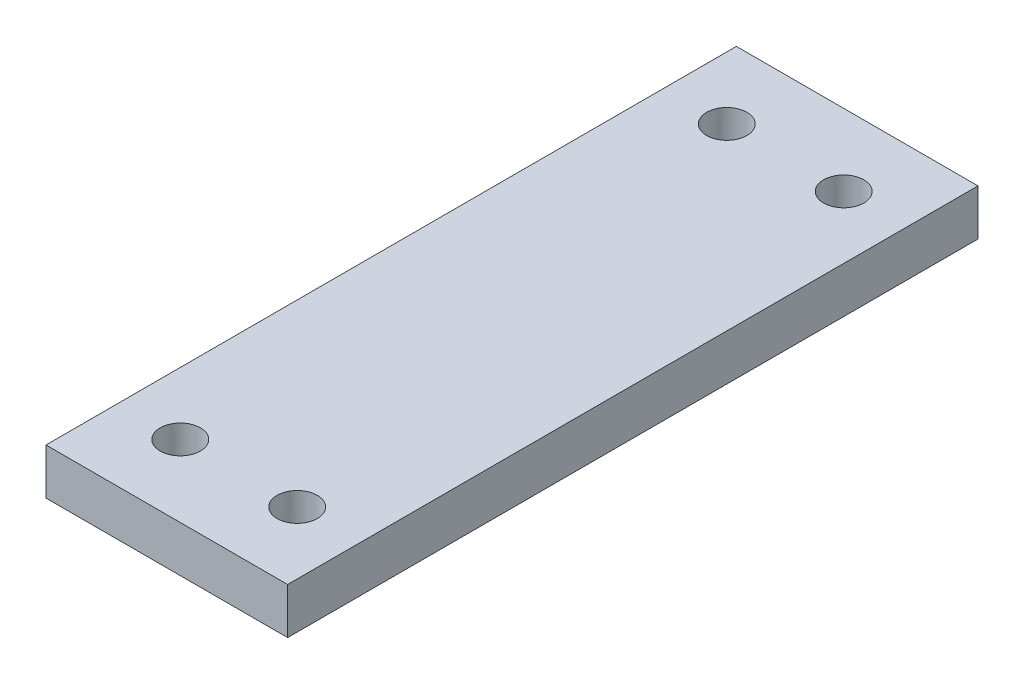
ISO-10303-21;
HEADER;
FILE_DESCRIPTION(('STEP AP214'),'2;1');
FILE_NAME('part.step','',(''),(''),'','','');
FILE_SCHEMA(('AUTOMOTIVE_DESIGN { 1 0 10303 214 1 1 1 1 }'));
ENDSEC;
DATA;
#1=APPLICATION_CONTEXT('core data for automotive mechanical design processes');
#2=APPLICATION_PROTOCOL_DEFINITION('international standard','automotive_design',2000,#1);
#3=PRODUCT_CONTEXT('',#1,'mechanical');
#4=PRODUCT('Part','Part','',(#3));
#5=PRODUCT_RELATED_PRODUCT_CATEGORY('part','',(#4));
#6=PRODUCT_DEFINITION_FORMATION('','',#4);
#7=PRODUCT_DEFINITION_CONTEXT('part definition',#1,'design');
#8=PRODUCT_DEFINITION('design','',#6,#7);
#9=PRODUCT_DEFINITION_SHAPE('','',#8);
#10=(LENGTH_UNIT() NAMED_UNIT(*) SI_UNIT(.MILLI.,.METRE.));
#11=(NAMED_UNIT(*) PLANE_ANGLE_UNIT() SI_UNIT($,.RADIAN.));
#12=(NAMED_UNIT(*) SI_UNIT($,.STERADIAN.) SOLID_ANGLE_UNIT());
#13=UNCERTAINTY_MEASURE_WITH_UNIT(LENGTH_MEASURE(1.E-05),#10,'distance_accuracy_value','');
#14=(GEOMETRIC_REPRESENTATION_CONTEXT(3) GLOBAL_UNCERTAINTY_ASSIGNED_CONTEXT((#13)) GLOBAL_UNIT_ASSIGNED_CONTEXT((#10,
#11,#12)) REPRESENTATION_CONTEXT('',''));
#15=CARTESIAN_POINT('',(0.,0.,0.));
#16=DIRECTION('',(0.,0.,1.));
#17=DIRECTION('',(1.,0.,0.));
#18=AXIS2_PLACEMENT_3D('',#15,#16,#17);
#19=CARTESIAN_POINT('',(-273.74896618523,-35.5197470884147,30.6347977229986));
#20=DIRECTION('',(-1.,0.,0.));
#21=DIRECTION('',(0.,0.,1.));
#22=AXIS2_PLACEMENT_3D('',#19,#20,#21);
#23=PLANE('',#22);
#24=DIRECTION('',(0.,0.,-1.));
#25=VECTOR('',#24,1.);
#26=CARTESIAN_POINT('',(-273.74896618523,-31.5197470884147,-12.3652022770014));
#27=LINE('',#26,#25);
#28=CARTESIAN_POINT('',(-273.74896618523,-31.5197470884147,39.1347977229986));
#29=VERTEX_POINT('',#28);
#30=CARTESIAN_POINT('',(-273.74896618523,-31.5197470884147,-20.8652022770014));
#31=VERTEX_POINT('',#30);
#32=EDGE_CURVE('E71',#29,#31,#27,.T.);
#33=ORIENTED_EDGE('',*,*,#32,.T.);
#34=DIRECTION('',(0.,-1.,0.));
#35=VECTOR('',#34,1.);
#36=CARTESIAN_POINT('',(-273.74896618523,-31.5197470884147,-20.8652022770014));
#37=LINE('',#36,#35);
#38=CARTESIAN_POINT('',(-273.74896618523,-35.5197470884147,-20.8652022770014));
#39=VERTEX_POINT('',#38);
#40=EDGE_CURVE('E83',#31,#39,#37,.T.);
#41=ORIENTED_EDGE('',*,*,#40,.T.);
#42=DIRECTION('',(0.,0.,1.));
#43=VECTOR('',#42,1.);
#44=CARTESIAN_POINT('',(-273.74896618523,-35.5197470884147,30.6347977229986));
#45=LINE('',#44,#43);
#46=CARTESIAN_POINT('',(-273.74896618523,-35.5197470884147,39.1347977229986));
#47=VERTEX_POINT('',#46);
#48=EDGE_CURVE('E65',#39,#47,#45,.T.);
#49=ORIENTED_EDGE('',*,*,#48,.T.);
#50=DIRECTION('',(0.,-1.,0.));
#51=VECTOR('',#50,1.);
#52=CARTESIAN_POINT('',(-273.74896618523,-31.5197470884147,39.1347977229986));
#53=LINE('',#52,#51);
#54=EDGE_CURVE('E80',#29,#47,#53,.T.);
#55=ORIENTED_EDGE('',*,*,#54,.F.);
#56=EDGE_LOOP('',(#33,#41,#49,#55));
#57=FACE_BOUND('',#56,.T.);
#58=ADVANCED_FACE('F37',(#57),#23,.T.);
#59=CARTESIAN_POINT('',(-252.74896618523,-35.5197470884147,30.6347977229986));
#60=DIRECTION('',(1.,0.,0.));
#61=DIRECTION('',(0.,0.,-1.));
#62=AXIS2_PLACEMENT_3D('',#59,#60,#61);
#63=PLANE('',#62);
#64=DIRECTION('',(0.,0.,1.));
#65=VECTOR('',#64,1.);
#66=CARTESIAN_POINT('',(-252.74896618523,-31.5197470884147,-12.3652022770014));
#67=LINE('',#66,#65);
#68=CARTESIAN_POINT('',(-252.74896618523,-31.5197470884147,-20.8652022770014));
#69=VERTEX_POINT('',#68);
#70=CARTESIAN_POINT('',(-252.74896618523,-31.5197470884147,39.1347977229986));
#71=VERTEX_POINT('',#70);
#72=EDGE_CURVE('E53',#69,#71,#67,.T.);
#73=ORIENTED_EDGE('',*,*,#72,.T.);
#74=DIRECTION('',(0.,-1.,0.));
#75=VECTOR('',#74,1.);
#76=CARTESIAN_POINT('',(-252.74896618523,-31.5197470884147,39.1347977229986));
#77=LINE('',#76,#75);
#78=CARTESIAN_POINT('',(-252.74896618523,-35.5197470884147,39.1347977229986));
#79=VERTEX_POINT('',#78);
#80=EDGE_CURVE('E94',#71,#79,#77,.T.);
#81=ORIENTED_EDGE('',*,*,#80,.T.);
#82=DIRECTION('',(0.,0.,-1.));
#83=VECTOR('',#82,1.);
#84=CARTESIAN_POINT('',(-252.74896618523,-35.5197470884147,30.6347977229986));
#85=LINE('',#84,#83);
#86=CARTESIAN_POINT('',(-252.74896618523,-35.5197470884147,-20.8652022770014));
#87=VERTEX_POINT('',#86);
#88=EDGE_CURVE('E45',#79,#87,#85,.T.);
#89=ORIENTED_EDGE('',*,*,#88,.T.);
#90=DIRECTION('',(0.,-1.,0.));
#91=VECTOR('',#90,1.);
#92=CARTESIAN_POINT('',(-252.74896618523,-31.5197470884147,-20.8652022770014));
#93=LINE('',#92,#91);
#94=EDGE_CURVE('E107',#69,#87,#93,.T.);
#95=ORIENTED_EDGE('',*,*,#94,.F.);
#96=EDGE_LOOP('',(#73,#81,#89,#95));
#97=FACE_BOUND('',#96,.T.);
#98=ADVANCED_FACE('F166',(#97),#63,.T.);
#99=CARTESIAN_POINT('',(-229.14595887983,-35.5197470884147,0.));
#100=DIRECTION('',(0.,1.,0.));
#101=DIRECTION('',(0.,0.,1.));
#102=AXIS2_PLACEMENT_3D('',#99,#100,#101);
#103=PLANE('',#102);
#104=CARTESIAN_POINT('',(-263.248966185229,-35.5197470884147,19.4217977229986));
#105=DIRECTION('',(0.,1.,0.));
#106=DIRECTION('',(0.,0.,1.));
#107=AXIS2_PLACEMENT_3D('',#104,#105,#106);
#108=CIRCLE('',#107,3.34999999999999);
#109=CARTESIAN_POINT('',(-263.248966185229,-35.5197470884147,22.7717977229986));
#110=VERTEX_POINT('',#109);
#111=EDGE_CURVE('E11',#110,#110,#108,.F.);
#112=ORIENTED_EDGE('',*,*,#111,.F.);
#113=EDGE_LOOP('',(#112));
#114=FACE_BOUND('',#113,.T.);
#115=CARTESIAN_POINT('',(-268.32896618523,-35.5197470884147,32.8837977229986));
#116=DIRECTION('',(0.,1.,0.));
#117=DIRECTION('',(0.,0.,1.));
#118=AXIS2_PLACEMENT_3D('',#115,#116,#117);
#119=CIRCLE('',#118,1.75);
#120=CARTESIAN_POINT('',(-268.32896618523,-35.5197470884147,34.6337977229986));
#121=VERTEX_POINT('',#120);
#122=EDGE_CURVE('E138',#121,#121,#119,.T.);
#123=ORIENTED_EDGE('',*,*,#122,.T.);
#124=EDGE_LOOP('',(#123));
#125=FACE_BOUND('',#124,.T.);
#126=CARTESIAN_POINT('',(-258.16896618523,-35.5197470884147,32.8837977229986));
#127=DIRECTION('',(0.,1.,0.));
#128=DIRECTION('',(0.,0.,1.));
#129=AXIS2_PLACEMENT_3D('',#126,#127,#128);
#130=CIRCLE('',#129,1.75);
#131=CARTESIAN_POINT('',(-258.16896618523,-35.5197470884147,34.6337977229986));
#132=VERTEX_POINT('',#131);
#133=EDGE_CURVE('E85',#132,#132,#130,.T.);
#134=ORIENTED_EDGE('',*,*,#133,.T.);
#135=EDGE_LOOP('',(#134));
#136=FACE_BOUND('',#135,.T.);
#137=ORIENTED_EDGE('',*,*,#48,.F.);
#138=DIRECTION('',(1.,0.,0.));
#139=VECTOR('',#138,1.);
#140=CARTESIAN_POINT('',(-252.74896618523,-35.5197470884147,-20.8652022770014));
#141=LINE('',#140,#139);
#142=EDGE_CURVE('E93',#39,#87,#141,.T.);
#143=ORIENTED_EDGE('',*,*,#142,.T.);
#144=ORIENTED_EDGE('',*,*,#88,.F.);
#145=DIRECTION('',(-1.,0.,0.));
#146=VECTOR('',#145,1.);
#147=CARTESIAN_POINT('',(-252.74896618523,-35.5197470884147,39.1347977229986));
#148=LINE('',#147,#146);
#149=EDGE_CURVE('E91',#79,#47,#148,.T.);
#150=ORIENTED_EDGE('',*,*,#149,.T.);
#151=EDGE_LOOP('',(#137,#143,#144,#150));
#152=FACE_BOUND('',#151,.T.);
#153=CARTESIAN_POINT('',(-268.32896618523,-35.5197470884147,-14.6142022770014));
#154=DIRECTION('',(0.,1.,0.));
#155=DIRECTION('',(0.,0.,1.));
#156=AXIS2_PLACEMENT_3D('',#153,#154,#155);
#157=CIRCLE('',#156,1.75);
#158=CARTESIAN_POINT('',(-268.32896618523,-35.5197470884147,-12.8642022770014));
#159=VERTEX_POINT('',#158);
#160=EDGE_CURVE('E130',#159,#159,#157,.T.);
#161=ORIENTED_EDGE('',*,*,#160,.T.);
#162=EDGE_LOOP('',(#161));
#163=FACE_BOUND('',#162,.T.);
#164=CARTESIAN_POINT('',(-258.16896618523,-35.5197470884147,-14.6142022770014));
#165=DIRECTION('',(0.,1.,0.));
#166=DIRECTION('',(0.,0.,1.));
#167=AXIS2_PLACEMENT_3D('',#164,#165,#166);
#168=CIRCLE('',#167,1.75);
#169=CARTESIAN_POINT('',(-258.16896618523,-35.5197470884147,-12.8642022770014));
#170=VERTEX_POINT('',#169);
#171=EDGE_CURVE('E133',#170,#170,#168,.T.);
#172=ORIENTED_EDGE('',*,*,#171,.T.);
#173=EDGE_LOOP('',(#172));
#174=FACE_BOUND('',#173,.T.);
#175=ADVANCED_FACE('F96',(#114,#125,#136,#152,#163,#174),#103,.F.);
#176=CARTESIAN_POINT('',(-258.16896618523,-35.5197470884147,32.8837977229986));
#177=DIRECTION('',(0.,1.,0.));
#178=DIRECTION('',(0.,0.,1.));
#179=AXIS2_PLACEMENT_3D('',#176,#177,#178);
#180=CYLINDRICAL_SURFACE('',#179,1.75);
#181=CARTESIAN_POINT('',(-258.16896618523,-31.5197470884147,32.8837977229986));
#182=DIRECTION('',(0.,-1.,0.));
#183=DIRECTION('',(0.,0.,-1.));
#184=AXIS2_PLACEMENT_3D('',#181,#182,#183);
#185=CIRCLE('',#184,1.75);
#186=CARTESIAN_POINT('',(-258.16896618523,-31.5197470884147,31.1337977229986));
#187=VERTEX_POINT('',#186);
#188=EDGE_CURVE('E118',#187,#187,#185,.T.);
#189=ORIENTED_EDGE('',*,*,#188,.F.);
#190=EDGE_LOOP('',(#189));
#191=FACE_BOUND('',#190,.T.);
#192=ORIENTED_EDGE('',*,*,#133,.F.);
#193=EDGE_LOOP('',(#192));
#194=FACE_BOUND('',#193,.T.);
#195=ADVANCED_FACE('F165',(#191,#194),#180,.F.);
#196=CARTESIAN_POINT('',(-268.32896618523,-35.5197470884147,32.8837977229986));
#197=DIRECTION('',(0.,1.,0.));
#198=DIRECTION('',(0.,0.,1.));
#199=AXIS2_PLACEMENT_3D('',#196,#197,#198);
#200=CYLINDRICAL_SURFACE('',#199,1.75);
#201=CARTESIAN_POINT('',(-268.32896618523,-31.5197470884147,32.8837977229986));
#202=DIRECTION('',(0.,-1.,0.));
#203=DIRECTION('',(0.,0.,-1.));
#204=AXIS2_PLACEMENT_3D('',#201,#202,#203);
#205=CIRCLE('',#204,1.75);
#206=CARTESIAN_POINT('',(-268.32896618523,-31.5197470884147,31.1337977229986));
#207=VERTEX_POINT('',#206);
#208=EDGE_CURVE('E117',#207,#207,#205,.T.);
#209=ORIENTED_EDGE('',*,*,#208,.F.);
#210=EDGE_LOOP('',(#209));
#211=FACE_BOUND('',#210,.T.);
#212=ORIENTED_EDGE('',*,*,#122,.F.);
#213=EDGE_LOOP('',(#212));
#214=FACE_BOUND('',#213,.T.);
#215=ADVANCED_FACE('F173',(#211,#214),#200,.F.);
#216=CARTESIAN_POINT('',(-229.14595887983,-31.5197470884147,0.));
#217=DIRECTION('',(0.,1.,0.));
#218=DIRECTION('',(0.,0.,1.));
#219=AXIS2_PLACEMENT_3D('',#216,#217,#218);
#220=PLANE('',#219);
#221=ORIENTED_EDGE('',*,*,#32,.F.);
#222=DIRECTION('',(-1.,0.,0.));
#223=VECTOR('',#222,1.);
#224=CARTESIAN_POINT('',(-252.74896618523,-31.5197470884147,39.1347977229986));
#225=LINE('',#224,#223);
#226=EDGE_CURVE('E92',#71,#29,#225,.T.);
#227=ORIENTED_EDGE('',*,*,#226,.F.);
#228=ORIENTED_EDGE('',*,*,#72,.F.);
#229=DIRECTION('',(1.,0.,0.));
#230=VECTOR('',#229,1.);
#231=CARTESIAN_POINT('',(-252.74896618523,-31.5197470884147,-20.8652022770014));
#232=LINE('',#231,#230);
#233=EDGE_CURVE('E103',#31,#69,#232,.T.);
#234=ORIENTED_EDGE('',*,*,#233,.F.);
#235=EDGE_LOOP('',(#221,#227,#228,#234));
#236=FACE_BOUND('',#235,.T.);
#237=ORIENTED_EDGE('',*,*,#188,.T.);
#238=EDGE_LOOP('',(#237));
#239=FACE_BOUND('',#238,.T.);
#240=ORIENTED_EDGE('',*,*,#208,.T.);
#241=EDGE_LOOP('',(#240));
#242=FACE_BOUND('',#241,.T.);
#243=CARTESIAN_POINT('',(-268.32896618523,-31.5197470884147,-14.6142022770014));
#244=DIRECTION('',(0.,-1.,0.));
#245=DIRECTION('',(0.,0.,-1.));
#246=AXIS2_PLACEMENT_3D('',#243,#244,#245);
#247=CIRCLE('',#246,1.75);
#248=CARTESIAN_POINT('',(-268.32896618523,-31.5197470884147,-16.3642022770014));
#249=VERTEX_POINT('',#248);
#250=EDGE_CURVE('E110',#249,#249,#247,.F.);
#251=ORIENTED_EDGE('',*,*,#250,.F.);
#252=EDGE_LOOP('',(#251));
#253=FACE_BOUND('',#252,.T.);
#254=CARTESIAN_POINT('',(-258.16896618523,-31.5197470884147,-14.6142022770014));
#255=DIRECTION('',(0.,-1.,0.));
#256=DIRECTION('',(0.,0.,-1.));
#257=AXIS2_PLACEMENT_3D('',#254,#255,#256);
#258=CIRCLE('',#257,1.75);
#259=CARTESIAN_POINT('',(-258.16896618523,-31.5197470884147,-16.3642022770014));
#260=VERTEX_POINT('',#259);
#261=EDGE_CURVE('E114',#260,#260,#258,.F.);
#262=ORIENTED_EDGE('',*,*,#261,.F.);
#263=EDGE_LOOP('',(#262));
#264=FACE_BOUND('',#263,.T.);
#265=ADVANCED_FACE('F179',(#236,#239,#242,#253,#264),#220,.T.);
#266=CARTESIAN_POINT('',(-258.16896618523,-35.5197470884147,-14.6142022770014));
#267=DIRECTION('',(0.,1.,0.));
#268=DIRECTION('',(0.,0.,1.));
#269=AXIS2_PLACEMENT_3D('',#266,#267,#268);
#270=CYLINDRICAL_SURFACE('',#269,1.75);
#271=ORIENTED_EDGE('',*,*,#261,.T.);
#272=EDGE_LOOP('',(#271));
#273=FACE_BOUND('',#272,.T.);
#274=ORIENTED_EDGE('',*,*,#171,.F.);
#275=EDGE_LOOP('',(#274));
#276=FACE_BOUND('',#275,.T.);
#277=ADVANCED_FACE('F192',(#273,#276),#270,.F.);
#278=CARTESIAN_POINT('',(-268.32896618523,-35.5197470884147,-14.6142022770014));
#279=DIRECTION('',(0.,1.,0.));
#280=DIRECTION('',(0.,0.,1.));
#281=AXIS2_PLACEMENT_3D('',#278,#279,#280);
#282=CYLINDRICAL_SURFACE('',#281,1.75);
#283=ORIENTED_EDGE('',*,*,#250,.T.);
#284=EDGE_LOOP('',(#283));
#285=FACE_BOUND('',#284,.T.);
#286=ORIENTED_EDGE('',*,*,#160,.F.);
#287=EDGE_LOOP('',(#286));
#288=FACE_BOUND('',#287,.T.);
#289=ADVANCED_FACE('F159',(#285,#288),#282,.F.);
#290=CARTESIAN_POINT('',(-263.248966185229,-36.0197470884147,19.4217977229986));
#291=DIRECTION('',(0.,1.,0.));
#292=DIRECTION('',(0.,0.,1.));
#293=AXIS2_PLACEMENT_3D('',#290,#291,#292);
#294=CYLINDRICAL_SURFACE('',#293,3.34999999999999);
#295=CARTESIAN_POINT('',(-263.248966185229,-36.0197470884147,19.4217977229986));
#296=DIRECTION('',(0.,-1.,0.));
#297=DIRECTION('',(0.,0.,-1.));
#298=AXIS2_PLACEMENT_3D('',#295,#296,#297);
#299=CIRCLE('',#298,3.34999999999999);
#300=CARTESIAN_POINT('',(-263.248966185229,-36.0197470884147,16.0717977229986));
#301=VERTEX_POINT('',#300);
#302=EDGE_CURVE('E121',#301,#301,#299,.T.);
#303=ORIENTED_EDGE('',*,*,#302,.F.);
#304=EDGE_LOOP('',(#303));
#305=FACE_BOUND('',#304,.T.);
#306=ORIENTED_EDGE('',*,*,#111,.T.);
#307=EDGE_LOOP('',(#306));
#308=FACE_BOUND('',#307,.T.);
#309=ADVANCED_FACE('F153',(#305,#308),#294,.T.);
#310=CARTESIAN_POINT('',(-263.248966185229,-36.0197470884147,19.4217977229986));
#311=DIRECTION('',(0.,-1.,0.));
#312=DIRECTION('',(0.,0.,-1.));
#313=AXIS2_PLACEMENT_3D('',#310,#311,#312);
#314=PLANE('',#313);
#315=CARTESIAN_POINT('',(-263.248966185229,-36.0197470884147,19.4217977229986));
#316=DIRECTION('',(0.,-1.,0.));
#317=DIRECTION('',(0.,0.,-1.));
#318=AXIS2_PLACEMENT_3D('',#315,#316,#317);
#319=CIRCLE('',#318,2.85);
#320=CARTESIAN_POINT('',(-263.248966185229,-36.0197470884147,16.5717977229986));
#321=VERTEX_POINT('',#320);
#322=EDGE_CURVE('E126',#321,#321,#319,.T.);
#323=ORIENTED_EDGE('',*,*,#322,.F.);
#324=EDGE_LOOP('',(#323));
#325=FACE_BOUND('',#324,.T.);
#326=ORIENTED_EDGE('',*,*,#302,.T.);
#327=EDGE_LOOP('',(#326));
#328=FACE_BOUND('',#327,.T.);
#329=ADVANCED_FACE('F149',(#325,#328),#314,.T.);
#330=CARTESIAN_POINT('',(-263.248966185229,-39.5197470884147,19.4217977229986));
#331=DIRECTION('',(0.,-1.,0.));
#332=DIRECTION('',(0.,0.,-1.));
#333=AXIS2_PLACEMENT_3D('',#330,#331,#332);
#334=PLANE('',#333);
#335=CARTESIAN_POINT('',(-263.248966185229,-39.5197470884147,19.4217977229986));
#336=DIRECTION('',(0.,-1.,0.));
#337=DIRECTION('',(0.,0.,-1.));
#338=AXIS2_PLACEMENT_3D('',#335,#336,#337);
#339=CIRCLE('',#338,2.85);
#340=CARTESIAN_POINT('',(-263.248966185229,-39.5197470884147,16.5717977229986));
#341=VERTEX_POINT('',#340);
#342=EDGE_CURVE('E127',#341,#341,#339,.T.);
#343=ORIENTED_EDGE('',*,*,#342,.T.);
#344=EDGE_LOOP('',(#343));
#345=FACE_BOUND('',#344,.T.);
#346=ADVANCED_FACE('F152',(#345),#334,.T.);
#347=CARTESIAN_POINT('',(-263.248966185229,-39.5197470884147,19.4217977229986));
#348=DIRECTION('',(0.,1.,0.));
#349=DIRECTION('',(0.,0.,1.));
#350=AXIS2_PLACEMENT_3D('',#347,#348,#349);
#351=CYLINDRICAL_SURFACE('',#350,2.85);
#352=ORIENTED_EDGE('',*,*,#322,.T.);
#353=EDGE_LOOP('',(#352));
#354=FACE_BOUND('',#353,.T.);
#355=ORIENTED_EDGE('',*,*,#342,.F.);
#356=EDGE_LOOP('',(#355));
#357=FACE_BOUND('',#356,.T.);
#358=ADVANCED_FACE('F146',(#354,#357),#351,.T.);
#359=CARTESIAN_POINT('',(-252.74896618523,-31.5197470884147,-20.8652022770014));
#360=DIRECTION('',(0.,0.,-1.));
#361=DIRECTION('',(0.,1.,0.));
#362=AXIS2_PLACEMENT_3D('',#359,#360,#361);
#363=PLANE('',#362);
#364=ORIENTED_EDGE('',*,*,#142,.F.);
#365=ORIENTED_EDGE('',*,*,#40,.F.);
#366=ORIENTED_EDGE('',*,*,#233,.T.);
#367=ORIENTED_EDGE('',*,*,#94,.T.);
#368=EDGE_LOOP('',(#364,#365,#366,#367));
#369=FACE_BOUND('',#368,.T.);
#370=ADVANCED_FACE('F214',(#369),#363,.T.);
#371=CARTESIAN_POINT('',(-252.74896618523,-31.5197470884147,39.1347977229986));
#372=DIRECTION('',(0.,0.,1.));
#373=DIRECTION('',(0.,-1.,0.));
#374=AXIS2_PLACEMENT_3D('',#371,#372,#373);
#375=PLANE('',#374);
#376=ORIENTED_EDGE('',*,*,#149,.F.);
#377=ORIENTED_EDGE('',*,*,#80,.F.);
#378=ORIENTED_EDGE('',*,*,#226,.T.);
#379=ORIENTED_EDGE('',*,*,#54,.T.);
#380=EDGE_LOOP('',(#376,#377,#378,#379));
#381=FACE_BOUND('',#380,.T.);
#382=ADVANCED_FACE('F89',(#381),#375,.T.);
#383=CLOSED_SHELL('',(#58,#98,#175,#195,#215,#265,#277,#289,#309,#329,#346,#358,#370,#382));
#384=MANIFOLD_SOLID_BREP('B2',#383);
#385=ADVANCED_BREP_SHAPE_REPRESENTATION('',(#18,#384),#14);
#386=SHAPE_DEFINITION_REPRESENTATION(#9,#385);
ENDSEC;
END-ISO-10303-21;
